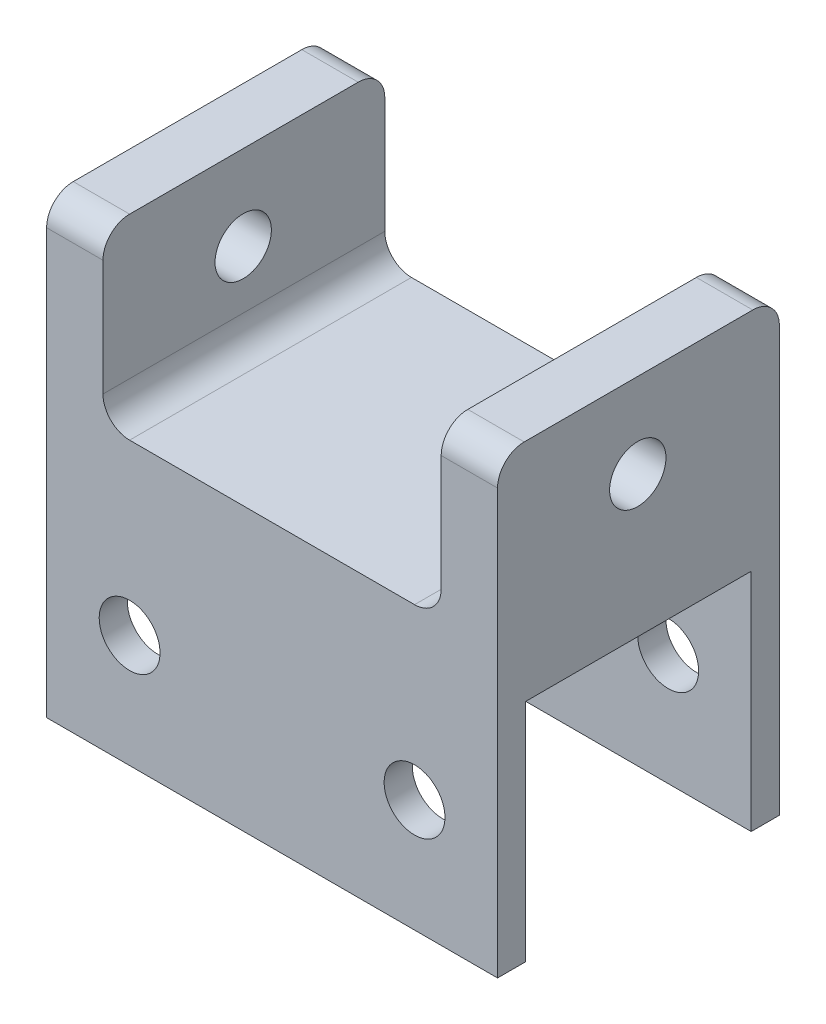
ISO-10303-21;
HEADER;
FILE_DESCRIPTION(('STEP AP214'),'2;1');
FILE_NAME('part.step','',(''),(''),'','','');
FILE_SCHEMA(('AUTOMOTIVE_DESIGN { 1 0 10303 214 1 1 1 1 }'));
ENDSEC;
DATA;
#1=APPLICATION_CONTEXT('core data for automotive mechanical design processes');
#2=APPLICATION_PROTOCOL_DEFINITION('international standard','automotive_design',2000,#1);
#3=PRODUCT_CONTEXT('',#1,'mechanical');
#4=PRODUCT('Part','Part','',(#3));
#5=PRODUCT_RELATED_PRODUCT_CATEGORY('part','',(#4));
#6=PRODUCT_DEFINITION_FORMATION('','',#4);
#7=PRODUCT_DEFINITION_CONTEXT('part definition',#1,'design');
#8=PRODUCT_DEFINITION('design','',#6,#7);
#9=PRODUCT_DEFINITION_SHAPE('','',#8);
#10=(LENGTH_UNIT() NAMED_UNIT(*) SI_UNIT(.MILLI.,.METRE.));
#11=(NAMED_UNIT(*) PLANE_ANGLE_UNIT() SI_UNIT($,.RADIAN.));
#12=(NAMED_UNIT(*) SI_UNIT($,.STERADIAN.) SOLID_ANGLE_UNIT());
#13=UNCERTAINTY_MEASURE_WITH_UNIT(LENGTH_MEASURE(1.E-05),#10,'distance_accuracy_value','');
#14=(GEOMETRIC_REPRESENTATION_CONTEXT(3) GLOBAL_UNCERTAINTY_ASSIGNED_CONTEXT((#13)) GLOBAL_UNIT_ASSIGNED_CONTEXT((#10,
#11,#12)) REPRESENTATION_CONTEXT('',''));
#15=CARTESIAN_POINT('',(0.,0.,0.));
#16=DIRECTION('',(0.,0.,1.));
#17=DIRECTION('',(1.,0.,0.));
#18=AXIS2_PLACEMENT_3D('',#15,#16,#17);
#19=CARTESIAN_POINT('',(0.,31.75,0.));
#20=DIRECTION('',(0.,1.,0.));
#21=DIRECTION('',(0.,0.,1.));
#22=AXIS2_PLACEMENT_3D('',#19,#20,#21);
#23=PLANE('',#22);
#24=DIRECTION('',(1.,0.,0.));
#25=VECTOR('',#24,1.);
#26=CARTESIAN_POINT('',(-109.740486484156,31.75,-28.2561073345159));
#27=LINE('',#26,#25);
#28=CARTESIAN_POINT('',(-100.390486484156,31.75,-28.2561073345159));
#29=VERTEX_POINT('',#28);
#30=CARTESIAN_POINT('',(-68.2904864841565,31.75,-28.2561073345159));
#31=VERTEX_POINT('',#30);
#32=EDGE_CURVE('E205',#29,#31,#27,.T.);
#33=ORIENTED_EDGE('',*,*,#32,.T.);
#34=DIRECTION('',(0.,0.,1.));
#35=VECTOR('',#34,1.);
#36=CARTESIAN_POINT('',(-68.2904864841565,31.75,0.));
#37=LINE('',#36,#35);
#38=CARTESIAN_POINT('',(-68.2904864841565,31.75,-60.0061073345159));
#39=VERTEX_POINT('',#38);
#40=EDGE_CURVE('E259',#31,#39,#37,.F.);
#41=ORIENTED_EDGE('',*,*,#40,.T.);
#42=DIRECTION('',(-1.,0.,0.));
#43=VECTOR('',#42,1.);
#44=CARTESIAN_POINT('',(-109.740486484156,31.75,-60.0061073345159));
#45=LINE('',#44,#43);
#46=CARTESIAN_POINT('',(-100.390486484156,31.75,-60.0061073345159));
#47=VERTEX_POINT('',#46);
#48=EDGE_CURVE('E201',#39,#47,#45,.T.);
#49=ORIENTED_EDGE('',*,*,#48,.T.);
#50=DIRECTION('',(0.,0.,-1.));
#51=VECTOR('',#50,1.);
#52=CARTESIAN_POINT('',(-100.390486484157,31.75,0.));
#53=LINE('',#52,#51);
#54=EDGE_CURVE('E257',#47,#29,#53,.F.);
#55=ORIENTED_EDGE('',*,*,#54,.T.);
#56=EDGE_LOOP('',(#33,#41,#49,#55));
#57=FACE_BOUND('',#56,.T.);
#58=ADVANCED_FACE('F33',(#57),#23,.T.);
#59=CARTESIAN_POINT('',(0.,0.,0.));
#60=DIRECTION('',(0.,1.,0.));
#61=DIRECTION('',(0.,0.,1.));
#62=AXIS2_PLACEMENT_3D('',#59,#60,#61);
#63=PLANE('',#62);
#64=DIRECTION('',(0.,0.,1.));
#65=VECTOR('',#64,1.);
#66=CARTESIAN_POINT('',(-109.740486484156,0.,-60.0061073345159));
#67=LINE('',#66,#65);
#68=CARTESIAN_POINT('',(-109.740486484156,0.,-31.4311073345159));
#69=VERTEX_POINT('',#68);
#70=CARTESIAN_POINT('',(-109.740486484156,0.,-28.2561073345159));
#71=VERTEX_POINT('',#70);
#72=EDGE_CURVE('E181',#69,#71,#67,.T.);
#73=ORIENTED_EDGE('',*,*,#72,.F.);
#74=DIRECTION('',(1.,0.,0.));
#75=VECTOR('',#74,1.);
#76=CARTESIAN_POINT('',(-109.740486484156,0.,-31.4311073345159));
#77=LINE('',#76,#75);
#78=CARTESIAN_POINT('',(-58.9404864841565,0.,-31.4311073345159));
#79=VERTEX_POINT('',#78);
#80=EDGE_CURVE('E162',#69,#79,#77,.T.);
#81=ORIENTED_EDGE('',*,*,#80,.T.);
#82=DIRECTION('',(0.,0.,-1.));
#83=VECTOR('',#82,1.);
#84=CARTESIAN_POINT('',(-58.9404864841565,0.,-60.0061073345159));
#85=LINE('',#84,#83);
#86=CARTESIAN_POINT('',(-58.9404864841565,0.,-28.2561073345159));
#87=VERTEX_POINT('',#86);
#88=EDGE_CURVE('E196',#87,#79,#85,.T.);
#89=ORIENTED_EDGE('',*,*,#88,.F.);
#90=DIRECTION('',(1.,0.,0.));
#91=VECTOR('',#90,1.);
#92=CARTESIAN_POINT('',(-109.740486484156,0.,-28.2561073345159));
#93=LINE('',#92,#91);
#94=EDGE_CURVE('E190',#71,#87,#93,.T.);
#95=ORIENTED_EDGE('',*,*,#94,.F.);
#96=EDGE_LOOP('',(#73,#81,#89,#95));
#97=FACE_BOUND('',#96,.T.);
#98=ADVANCED_FACE('F188',(#97),#63,.F.);
#99=CARTESIAN_POINT('',(-58.9404864841565,31.75,-60.0061073345159));
#100=DIRECTION('',(-1.,0.,0.));
#101=DIRECTION('',(0.,0.,1.));
#102=AXIS2_PLACEMENT_3D('',#99,#100,#101);
#103=PLANE('',#102);
#104=CARTESIAN_POINT('',(-58.9404864841564,41.275,-44.0530571686081));
#105=DIRECTION('',(1.,0.,0.));
#106=DIRECTION('',(0.,0.,-1.));
#107=AXIS2_PLACEMENT_3D('',#104,#105,#106);
#108=CIRCLE('',#107,3.175);
#109=CARTESIAN_POINT('',(-58.9404864841564,41.275,-47.2280571686081));
#110=VERTEX_POINT('',#109);
#111=EDGE_CURVE('E272',#110,#110,#108,.T.);
#112=ORIENTED_EDGE('',*,*,#111,.F.);
#113=EDGE_LOOP('',(#112));
#114=FACE_BOUND('',#113,.T.);
#115=DIRECTION('',(0.,0.,-1.));
#116=VECTOR('',#115,1.);
#117=CARTESIAN_POINT('',(-58.9404864841565,50.8,-60.0061073345159));
#118=LINE('',#117,#116);
#119=CARTESIAN_POINT('',(-58.9404864841565,50.8,-31.2561073345159));
#120=VERTEX_POINT('',#119);
#121=CARTESIAN_POINT('',(-58.9404864841565,50.8,-57.0061073345159));
#122=VERTEX_POINT('',#121);
#123=EDGE_CURVE('E294',#120,#122,#118,.T.);
#124=ORIENTED_EDGE('',*,*,#123,.F.);
#125=CARTESIAN_POINT('',(-58.9404864841565,47.8,-31.2561073345159));
#126=DIRECTION('',(-1.,0.,0.));
#127=DIRECTION('',(0.,0.,1.));
#128=AXIS2_PLACEMENT_3D('',#125,#126,#127);
#129=CIRCLE('',#128,3.);
#130=CARTESIAN_POINT('',(-58.9404864841565,47.8,-28.2561073345159));
#131=VERTEX_POINT('',#130);
#132=EDGE_CURVE('E250',#120,#131,#129,.F.);
#133=ORIENTED_EDGE('',*,*,#132,.T.);
#134=DIRECTION('',(0.,-1.,0.));
#135=VECTOR('',#134,1.);
#136=CARTESIAN_POINT('',(-58.9404864841565,31.75,-28.2561073345159));
#137=LINE('',#136,#135);
#138=EDGE_CURVE('E202',#131,#87,#137,.T.);
#139=ORIENTED_EDGE('',*,*,#138,.T.);
#140=ORIENTED_EDGE('',*,*,#88,.T.);
#141=DIRECTION('',(0.,-1.,0.));
#142=VECTOR('',#141,1.);
#143=CARTESIAN_POINT('',(-58.9404864841565,25.4,-31.4311073345159));
#144=LINE('',#143,#142);
#145=CARTESIAN_POINT('',(-58.9404864841565,25.4,-31.4311073345159));
#146=VERTEX_POINT('',#145);
#147=EDGE_CURVE('E168',#146,#79,#144,.T.);
#148=ORIENTED_EDGE('',*,*,#147,.F.);
#149=DIRECTION('',(0.,0.,1.));
#150=VECTOR('',#149,1.);
#151=CARTESIAN_POINT('',(-58.9404864841565,25.4,-31.4311073345159));
#152=LINE('',#151,#150);
#153=CARTESIAN_POINT('',(-58.9404864841565,25.4,-56.8311073345159));
#154=VERTEX_POINT('',#153);
#155=EDGE_CURVE('E186',#154,#146,#152,.T.);
#156=ORIENTED_EDGE('',*,*,#155,.F.);
#157=DIRECTION('',(0.,1.,0.));
#158=VECTOR('',#157,1.);
#159=CARTESIAN_POINT('',(-58.9404864841565,25.4,-56.8311073345159));
#160=LINE('',#159,#158);
#161=CARTESIAN_POINT('',(-58.9404864841565,0.,-56.8311073345159));
#162=VERTEX_POINT('',#161);
#163=EDGE_CURVE('E314',#162,#154,#160,.T.);
#164=ORIENTED_EDGE('',*,*,#163,.F.);
#165=CARTESIAN_POINT('',(-58.9404864841565,0.,-60.0061073345159));
#166=VERTEX_POINT('',#165);
#167=EDGE_CURVE('E321',#162,#166,#85,.T.);
#168=ORIENTED_EDGE('',*,*,#167,.T.);
#169=DIRECTION('',(0.,-1.,0.));
#170=VECTOR('',#169,1.);
#171=CARTESIAN_POINT('',(-58.9404864841565,31.75,-60.0061073345159));
#172=LINE('',#171,#170);
#173=CARTESIAN_POINT('',(-58.9404864841565,47.8,-60.0061073345159));
#174=VERTEX_POINT('',#173);
#175=EDGE_CURVE('E209',#174,#166,#172,.T.);
#176=ORIENTED_EDGE('',*,*,#175,.F.);
#177=CARTESIAN_POINT('',(-58.9404864841565,47.8,-57.0061073345159));
#178=DIRECTION('',(-1.,0.,0.));
#179=DIRECTION('',(0.,0.,1.));
#180=AXIS2_PLACEMENT_3D('',#177,#178,#179);
#181=CIRCLE('',#180,3.);
#182=EDGE_CURVE('E248',#174,#122,#181,.F.);
#183=ORIENTED_EDGE('',*,*,#182,.T.);
#184=EDGE_LOOP('',(#124,#133,#139,#140,#148,#156,#164,#168,#176,#183));
#185=FACE_BOUND('',#184,.T.);
#186=ADVANCED_FACE('F334',(#114,#185),#103,.F.);
#187=CARTESIAN_POINT('',(-109.740486484156,31.75,-60.0061073345159));
#188=DIRECTION('',(0.,0.,1.));
#189=DIRECTION('',(1.,0.,0.));
#190=AXIS2_PLACEMENT_3D('',#187,#188,#189);
#191=PLANE('',#190);
#192=CARTESIAN_POINT('',(-100.390486484156,12.7,-60.0061073345159));
#193=DIRECTION('',(0.,0.,-1.));
#194=DIRECTION('',(-1.,0.,0.));
#195=AXIS2_PLACEMENT_3D('',#192,#193,#194);
#196=CIRCLE('',#195,3.429);
#197=CARTESIAN_POINT('',(-103.819486484156,12.7,-60.0061073345159));
#198=VERTEX_POINT('',#197);
#199=EDGE_CURVE('E469',#198,#198,#196,.T.);
#200=ORIENTED_EDGE('',*,*,#199,.F.);
#201=EDGE_LOOP('',(#200));
#202=FACE_BOUND('',#201,.T.);
#203=CARTESIAN_POINT('',(-68.2904864841565,12.7,-60.0061073345159));
#204=DIRECTION('',(0.,0.,-1.));
#205=DIRECTION('',(-1.,0.,0.));
#206=AXIS2_PLACEMENT_3D('',#203,#204,#205);
#207=CIRCLE('',#206,3.429);
#208=CARTESIAN_POINT('',(-71.7194864841565,12.7,-60.0061073345159));
#209=VERTEX_POINT('',#208);
#210=EDGE_CURVE('E275',#209,#209,#207,.T.);
#211=ORIENTED_EDGE('',*,*,#210,.F.);
#212=EDGE_LOOP('',(#211));
#213=FACE_BOUND('',#212,.T.);
#214=DIRECTION('',(0.,-1.,0.));
#215=VECTOR('',#214,1.);
#216=CARTESIAN_POINT('',(-109.740486484156,31.75,-60.0061073345159));
#217=LINE('',#216,#215);
#218=CARTESIAN_POINT('',(-109.740486484156,47.8,-60.0061073345159));
#219=VERTEX_POINT('',#218);
#220=CARTESIAN_POINT('',(-109.740486484156,0.,-60.0061073345159));
#221=VERTEX_POINT('',#220);
#222=EDGE_CURVE('E207',#219,#221,#217,.T.);
#223=ORIENTED_EDGE('',*,*,#222,.F.);
#224=DIRECTION('',(-1.,0.,0.));
#225=VECTOR('',#224,1.);
#226=CARTESIAN_POINT('',(-109.740486484156,47.8,-60.0061073345159));
#227=LINE('',#226,#225);
#228=CARTESIAN_POINT('',(-103.390486484156,47.8,-60.0061073345159));
#229=VERTEX_POINT('',#228);
#230=EDGE_CURVE('E439',#219,#229,#227,.F.);
#231=ORIENTED_EDGE('',*,*,#230,.T.);
#232=DIRECTION('',(0.,-1.,0.));
#233=VECTOR('',#232,1.);
#234=CARTESIAN_POINT('',(-103.390486484156,50.8,-60.0061073345159));
#235=LINE('',#234,#233);
#236=CARTESIAN_POINT('',(-103.390486484156,34.75,-60.0061073345159));
#237=VERTEX_POINT('',#236);
#238=EDGE_CURVE('E217',#229,#237,#235,.T.);
#239=ORIENTED_EDGE('',*,*,#238,.T.);
#240=CARTESIAN_POINT('',(-100.390486484156,34.75,-60.0061073345159));
#241=DIRECTION('',(0.,0.,1.));
#242=DIRECTION('',(1.,0.,0.));
#243=AXIS2_PLACEMENT_3D('',#240,#241,#242);
#244=CIRCLE('',#243,3.);
#245=EDGE_CURVE('E42',#237,#47,#244,.T.);
#246=ORIENTED_EDGE('',*,*,#245,.T.);
#247=ORIENTED_EDGE('',*,*,#48,.F.);
#248=CARTESIAN_POINT('',(-68.2904864841565,34.75,-60.0061073345159));
#249=DIRECTION('',(0.,0.,1.));
#250=DIRECTION('',(1.,0.,0.));
#251=AXIS2_PLACEMENT_3D('',#248,#249,#250);
#252=CIRCLE('',#251,3.);
#253=CARTESIAN_POINT('',(-65.2904864841565,34.75,-60.0061073345159));
#254=VERTEX_POINT('',#253);
#255=EDGE_CURVE('E263',#39,#254,#252,.T.);
#256=ORIENTED_EDGE('',*,*,#255,.T.);
#257=DIRECTION('',(0.,-1.,0.));
#258=VECTOR('',#257,1.);
#259=CARTESIAN_POINT('',(-65.2904864841565,50.8,-60.0061073345159));
#260=LINE('',#259,#258);
#261=CARTESIAN_POINT('',(-65.2904864841565,47.8,-60.0061073345159));
#262=VERTEX_POINT('',#261);
#263=EDGE_CURVE('E302',#262,#254,#260,.T.);
#264=ORIENTED_EDGE('',*,*,#263,.F.);
#265=DIRECTION('',(-1.,0.,0.));
#266=VECTOR('',#265,1.);
#267=CARTESIAN_POINT('',(-109.740486484156,47.8,-60.0061073345159));
#268=LINE('',#267,#266);
#269=EDGE_CURVE('E227',#262,#174,#268,.F.);
#270=ORIENTED_EDGE('',*,*,#269,.T.);
#271=ORIENTED_EDGE('',*,*,#175,.T.);
#272=DIRECTION('',(-1.,0.,0.));
#273=VECTOR('',#272,1.);
#274=CARTESIAN_POINT('',(-109.740486484156,0.,-60.0061073345159));
#275=LINE('',#274,#273);
#276=EDGE_CURVE('E192',#166,#221,#275,.T.);
#277=ORIENTED_EDGE('',*,*,#276,.T.);
#278=EDGE_LOOP('',(#223,#231,#239,#246,#247,#256,#264,#270,#271,#277));
#279=FACE_BOUND('',#278,.T.);
#280=ADVANCED_FACE('F390',(#202,#213,#279),#191,.F.);
#281=CARTESIAN_POINT('',(-109.740486484156,31.75,-60.0061073345159));
#282=DIRECTION('',(1.,0.,0.));
#283=DIRECTION('',(0.,0.,-1.));
#284=AXIS2_PLACEMENT_3D('',#281,#282,#283);
#285=PLANE('',#284);
#286=CARTESIAN_POINT('',(-109.740486484156,41.275,-44.0530571686081));
#287=DIRECTION('',(1.,0.,0.));
#288=DIRECTION('',(0.,0.,-1.));
#289=AXIS2_PLACEMENT_3D('',#286,#287,#288);
#290=CIRCLE('',#289,3.175);
#291=CARTESIAN_POINT('',(-109.740486484156,41.275,-47.2280571686081));
#292=VERTEX_POINT('',#291);
#293=EDGE_CURVE('E287',#292,#292,#290,.T.);
#294=ORIENTED_EDGE('',*,*,#293,.T.);
#295=EDGE_LOOP('',(#294));
#296=FACE_BOUND('',#295,.T.);
#297=DIRECTION('',(0.,0.,1.));
#298=VECTOR('',#297,1.);
#299=CARTESIAN_POINT('',(-109.740486484156,50.8,-60.0061073345159));
#300=LINE('',#299,#298);
#301=CARTESIAN_POINT('',(-109.740486484156,50.8,-57.0061073345159));
#302=VERTEX_POINT('',#301);
#303=CARTESIAN_POINT('',(-109.740486484156,50.8,-31.2561073345159));
#304=VERTEX_POINT('',#303);
#305=EDGE_CURVE('E308',#302,#304,#300,.T.);
#306=ORIENTED_EDGE('',*,*,#305,.F.);
#307=CARTESIAN_POINT('',(-109.740486484156,47.8,-57.0061073345159));
#308=DIRECTION('',(1.,0.,0.));
#309=DIRECTION('',(0.,0.,-1.));
#310=AXIS2_PLACEMENT_3D('',#307,#308,#309);
#311=CIRCLE('',#310,3.);
#312=EDGE_CURVE('E222',#302,#219,#311,.F.);
#313=ORIENTED_EDGE('',*,*,#312,.T.);
#314=ORIENTED_EDGE('',*,*,#222,.T.);
#315=CARTESIAN_POINT('',(-109.740486484156,0.,-56.8311073345159));
#316=VERTEX_POINT('',#315);
#317=EDGE_CURVE('E191',#221,#316,#67,.T.);
#318=ORIENTED_EDGE('',*,*,#317,.T.);
#319=DIRECTION('',(0.,1.,0.));
#320=VECTOR('',#319,1.);
#321=CARTESIAN_POINT('',(-109.740486484156,25.4,-56.8311073345159));
#322=LINE('',#321,#320);
#323=CARTESIAN_POINT('',(-109.740486484156,25.4,-56.8311073345159));
#324=VERTEX_POINT('',#323);
#325=EDGE_CURVE('E185',#316,#324,#322,.T.);
#326=ORIENTED_EDGE('',*,*,#325,.T.);
#327=DIRECTION('',(0.,0.,1.));
#328=VECTOR('',#327,1.);
#329=CARTESIAN_POINT('',(-109.740486484156,25.4,-31.4311073345159));
#330=LINE('',#329,#328);
#331=CARTESIAN_POINT('',(-109.740486484156,25.4,-31.4311073345159));
#332=VERTEX_POINT('',#331);
#333=EDGE_CURVE('E174',#324,#332,#330,.T.);
#334=ORIENTED_EDGE('',*,*,#333,.T.);
#335=DIRECTION('',(0.,-1.,0.));
#336=VECTOR('',#335,1.);
#337=CARTESIAN_POINT('',(-109.740486484156,25.4,-31.4311073345159));
#338=LINE('',#337,#336);
#339=EDGE_CURVE('E165',#332,#69,#338,.T.);
#340=ORIENTED_EDGE('',*,*,#339,.T.);
#341=ORIENTED_EDGE('',*,*,#72,.T.);
#342=DIRECTION('',(0.,-1.,0.));
#343=VECTOR('',#342,1.);
#344=CARTESIAN_POINT('',(-109.740486484156,31.75,-28.2561073345159));
#345=LINE('',#344,#343);
#346=CARTESIAN_POINT('',(-109.740486484156,47.8,-28.2561073345159));
#347=VERTEX_POINT('',#346);
#348=EDGE_CURVE('E204',#347,#71,#345,.T.);
#349=ORIENTED_EDGE('',*,*,#348,.F.);
#350=CARTESIAN_POINT('',(-109.740486484156,47.8,-31.2561073345159));
#351=DIRECTION('',(1.,0.,0.));
#352=DIRECTION('',(0.,0.,-1.));
#353=AXIS2_PLACEMENT_3D('',#350,#351,#352);
#354=CIRCLE('',#353,3.);
#355=EDGE_CURVE('E345',#347,#304,#354,.F.);
#356=ORIENTED_EDGE('',*,*,#355,.T.);
#357=EDGE_LOOP('',(#306,#313,#314,#318,#326,#334,#340,#341,#349,#356));
#358=FACE_BOUND('',#357,.T.);
#359=ADVANCED_FACE('F179',(#296,#358),#285,.F.);
#360=CARTESIAN_POINT('',(-109.740486484156,31.75,-28.2561073345159));
#361=DIRECTION('',(0.,0.,-1.));
#362=DIRECTION('',(-1.,0.,0.));
#363=AXIS2_PLACEMENT_3D('',#360,#361,#362);
#364=PLANE('',#363);
#365=CARTESIAN_POINT('',(-100.390486484156,12.7,-28.2561073345159));
#366=DIRECTION('',(0.,0.,-1.));
#367=DIRECTION('',(-1.,0.,0.));
#368=AXIS2_PLACEMENT_3D('',#365,#366,#367);
#369=CIRCLE('',#368,3.429);
#370=CARTESIAN_POINT('',(-103.819486484156,12.7,-28.2561073345159));
#371=VERTEX_POINT('',#370);
#372=EDGE_CURVE('E466',#371,#371,#369,.T.);
#373=ORIENTED_EDGE('',*,*,#372,.T.);
#374=EDGE_LOOP('',(#373));
#375=FACE_BOUND('',#374,.T.);
#376=CARTESIAN_POINT('',(-68.2904864841565,12.7,-28.2561073345159));
#377=DIRECTION('',(0.,0.,-1.));
#378=DIRECTION('',(-1.,0.,0.));
#379=AXIS2_PLACEMENT_3D('',#376,#377,#378);
#380=CIRCLE('',#379,3.429);
#381=CARTESIAN_POINT('',(-71.7194864841565,12.7,-28.2561073345159));
#382=VERTEX_POINT('',#381);
#383=EDGE_CURVE('E268',#382,#382,#380,.T.);
#384=ORIENTED_EDGE('',*,*,#383,.T.);
#385=EDGE_LOOP('',(#384));
#386=FACE_BOUND('',#385,.T.);
#387=DIRECTION('',(0.,-1.,0.));
#388=VECTOR('',#387,1.);
#389=CARTESIAN_POINT('',(-103.390486484156,50.8,-28.2561073345159));
#390=LINE('',#389,#388);
#391=CARTESIAN_POINT('',(-103.390486484156,47.8,-28.2561073345159));
#392=VERTEX_POINT('',#391);
#393=CARTESIAN_POINT('',(-103.390486484156,34.75,-28.2561073345159));
#394=VERTEX_POINT('',#393);
#395=EDGE_CURVE('E221',#392,#394,#390,.T.);
#396=ORIENTED_EDGE('',*,*,#395,.F.);
#397=DIRECTION('',(1.,0.,0.));
#398=VECTOR('',#397,1.);
#399=CARTESIAN_POINT('',(-109.740486484156,47.8,-28.2561073345159));
#400=LINE('',#399,#398);
#401=EDGE_CURVE('E241',#392,#347,#400,.F.);
#402=ORIENTED_EDGE('',*,*,#401,.T.);
#403=ORIENTED_EDGE('',*,*,#348,.T.);
#404=ORIENTED_EDGE('',*,*,#94,.T.);
#405=ORIENTED_EDGE('',*,*,#138,.F.);
#406=DIRECTION('',(1.,0.,0.));
#407=VECTOR('',#406,1.);
#408=CARTESIAN_POINT('',(-109.740486484156,47.8,-28.2561073345159));
#409=LINE('',#408,#407);
#410=CARTESIAN_POINT('',(-65.2904864841565,47.8,-28.2561073345159));
#411=VERTEX_POINT('',#410);
#412=EDGE_CURVE('E239',#131,#411,#409,.F.);
#413=ORIENTED_EDGE('',*,*,#412,.T.);
#414=DIRECTION('',(0.,-1.,0.));
#415=VECTOR('',#414,1.);
#416=CARTESIAN_POINT('',(-65.2904864841565,50.8,-28.2561073345159));
#417=LINE('',#416,#415);
#418=CARTESIAN_POINT('',(-65.2904864841565,34.75,-28.2561073345159));
#419=VERTEX_POINT('',#418);
#420=EDGE_CURVE('E299',#411,#419,#417,.T.);
#421=ORIENTED_EDGE('',*,*,#420,.T.);
#422=CARTESIAN_POINT('',(-68.2904864841565,34.75,-28.2561073345159));
#423=DIRECTION('',(0.,0.,-1.));
#424=DIRECTION('',(-1.,0.,0.));
#425=AXIS2_PLACEMENT_3D('',#422,#423,#424);
#426=CIRCLE('',#425,3.);
#427=EDGE_CURVE('E261',#419,#31,#426,.T.);
#428=ORIENTED_EDGE('',*,*,#427,.T.);
#429=ORIENTED_EDGE('',*,*,#32,.F.);
#430=CARTESIAN_POINT('',(-100.390486484156,34.75,-28.2561073345159));
#431=DIRECTION('',(0.,0.,-1.));
#432=DIRECTION('',(-1.,0.,0.));
#433=AXIS2_PLACEMENT_3D('',#430,#431,#432);
#434=CIRCLE('',#433,3.);
#435=EDGE_CURVE('E11',#29,#394,#434,.T.);
#436=ORIENTED_EDGE('',*,*,#435,.T.);
#437=EDGE_LOOP('',(#396,#402,#403,#404,#405,#413,#421,#428,#429,#436));
#438=FACE_BOUND('',#437,.T.);
#439=ADVANCED_FACE('F342',(#375,#386,#438),#364,.F.);
#440=ORIENTED_EDGE('',*,*,#167,.F.);
#441=DIRECTION('',(1.,0.,0.));
#442=VECTOR('',#441,1.);
#443=CARTESIAN_POINT('',(-109.740486484156,0.,-56.8311073345159));
#444=LINE('',#443,#442);
#445=EDGE_CURVE('E173',#316,#162,#444,.T.);
#446=ORIENTED_EDGE('',*,*,#445,.F.);
#447=ORIENTED_EDGE('',*,*,#317,.F.);
#448=ORIENTED_EDGE('',*,*,#276,.F.);
#449=EDGE_LOOP('',(#440,#446,#447,#448));
#450=FACE_BOUND('',#449,.T.);
#451=ADVANCED_FACE('F337',(#450),#63,.F.);
#452=CARTESIAN_POINT('',(-109.740486484156,25.4,-31.4311073345159));
#453=DIRECTION('',(0.,0.,1.));
#454=DIRECTION('',(1.,0.,0.));
#455=AXIS2_PLACEMENT_3D('',#452,#453,#454);
#456=PLANE('',#455);
#457=CARTESIAN_POINT('',(-100.390486484156,12.7,-31.4311073345159));
#458=DIRECTION('',(0.,0.,1.));
#459=DIRECTION('',(1.,0.,0.));
#460=AXIS2_PLACEMENT_3D('',#457,#458,#459);
#461=CIRCLE('',#460,3.429);
#462=CARTESIAN_POINT('',(-96.9614864841565,12.7,-31.4311073345159));
#463=VERTEX_POINT('',#462);
#464=EDGE_CURVE('E280',#463,#463,#461,.T.);
#465=ORIENTED_EDGE('',*,*,#464,.T.);
#466=EDGE_LOOP('',(#465));
#467=FACE_BOUND('',#466,.T.);
#468=CARTESIAN_POINT('',(-68.2904864841565,12.7,-31.4311073345159));
#469=DIRECTION('',(0.,0.,1.));
#470=DIRECTION('',(1.,0.,0.));
#471=AXIS2_PLACEMENT_3D('',#468,#469,#470);
#472=CIRCLE('',#471,3.429);
#473=CARTESIAN_POINT('',(-64.8614864841565,12.7,-31.4311073345159));
#474=VERTEX_POINT('',#473);
#475=EDGE_CURVE('E267',#474,#474,#472,.T.);
#476=ORIENTED_EDGE('',*,*,#475,.T.);
#477=EDGE_LOOP('',(#476));
#478=FACE_BOUND('',#477,.T.);
#479=ORIENTED_EDGE('',*,*,#147,.T.);
#480=ORIENTED_EDGE('',*,*,#80,.F.);
#481=ORIENTED_EDGE('',*,*,#339,.F.);
#482=DIRECTION('',(1.,0.,0.));
#483=VECTOR('',#482,1.);
#484=CARTESIAN_POINT('',(-109.740486484156,25.4,-31.4311073345159));
#485=LINE('',#484,#483);
#486=EDGE_CURVE('E319',#332,#146,#485,.T.);
#487=ORIENTED_EDGE('',*,*,#486,.T.);
#488=EDGE_LOOP('',(#479,#480,#481,#487));
#489=FACE_BOUND('',#488,.T.);
#490=ADVANCED_FACE('F164',(#467,#478,#489),#456,.F.);
#491=CARTESIAN_POINT('',(-109.740486484156,25.4,-31.4311073345159));
#492=DIRECTION('',(0.,1.,0.));
#493=DIRECTION('',(0.,0.,1.));
#494=AXIS2_PLACEMENT_3D('',#491,#492,#493);
#495=PLANE('',#494);
#496=ORIENTED_EDGE('',*,*,#155,.T.);
#497=ORIENTED_EDGE('',*,*,#486,.F.);
#498=ORIENTED_EDGE('',*,*,#333,.F.);
#499=DIRECTION('',(1.,0.,0.));
#500=VECTOR('',#499,1.);
#501=CARTESIAN_POINT('',(-109.740486484156,25.4,-56.8311073345159));
#502=LINE('',#501,#500);
#503=EDGE_CURVE('E322',#324,#154,#502,.T.);
#504=ORIENTED_EDGE('',*,*,#503,.T.);
#505=EDGE_LOOP('',(#496,#497,#498,#504));
#506=FACE_BOUND('',#505,.T.);
#507=ADVANCED_FACE('F456',(#506),#495,.F.);
#508=CARTESIAN_POINT('',(-109.740486484156,25.4,-56.8311073345159));
#509=DIRECTION('',(0.,0.,-1.));
#510=DIRECTION('',(-1.,0.,0.));
#511=AXIS2_PLACEMENT_3D('',#508,#509,#510);
#512=PLANE('',#511);
#513=CARTESIAN_POINT('',(-100.390486484156,12.7,-56.8311073345159));
#514=DIRECTION('',(0.,0.,-1.));
#515=DIRECTION('',(-1.,0.,0.));
#516=AXIS2_PLACEMENT_3D('',#513,#514,#515);
#517=CIRCLE('',#516,3.429);
#518=CARTESIAN_POINT('',(-103.819486484156,12.7,-56.8311073345159));
#519=VERTEX_POINT('',#518);
#520=EDGE_CURVE('E37',#519,#519,#517,.T.);
#521=ORIENTED_EDGE('',*,*,#520,.T.);
#522=EDGE_LOOP('',(#521));
#523=FACE_BOUND('',#522,.T.);
#524=CARTESIAN_POINT('',(-68.2904864841565,12.7,-56.8311073345159));
#525=DIRECTION('',(0.,0.,-1.));
#526=DIRECTION('',(-1.,0.,0.));
#527=AXIS2_PLACEMENT_3D('',#524,#525,#526);
#528=CIRCLE('',#527,3.429);
#529=CARTESIAN_POINT('',(-71.7194864841565,12.7,-56.8311073345159));
#530=VERTEX_POINT('',#529);
#531=EDGE_CURVE('E265',#530,#530,#528,.T.);
#532=ORIENTED_EDGE('',*,*,#531,.T.);
#533=EDGE_LOOP('',(#532));
#534=FACE_BOUND('',#533,.T.);
#535=ORIENTED_EDGE('',*,*,#163,.T.);
#536=ORIENTED_EDGE('',*,*,#503,.F.);
#537=ORIENTED_EDGE('',*,*,#325,.F.);
#538=ORIENTED_EDGE('',*,*,#445,.T.);
#539=EDGE_LOOP('',(#535,#536,#537,#538));
#540=FACE_BOUND('',#539,.T.);
#541=ADVANCED_FACE('F326',(#523,#534,#540),#512,.F.);
#542=CARTESIAN_POINT('',(-103.390486484156,50.8,-60.0061073345159));
#543=DIRECTION('',(-1.,0.,0.));
#544=DIRECTION('',(0.,0.,1.));
#545=AXIS2_PLACEMENT_3D('',#542,#543,#544);
#546=PLANE('',#545);
#547=CARTESIAN_POINT('',(-103.390486484156,41.275,-44.0530571686081));
#548=DIRECTION('',(-1.,0.,0.));
#549=DIRECTION('',(0.,0.,1.));
#550=AXIS2_PLACEMENT_3D('',#547,#548,#549);
#551=CIRCLE('',#550,3.175);
#552=CARTESIAN_POINT('',(-103.390486484156,41.275,-40.8780571686082));
#553=VERTEX_POINT('',#552);
#554=EDGE_CURVE('E291',#553,#553,#551,.T.);
#555=ORIENTED_EDGE('',*,*,#554,.T.);
#556=EDGE_LOOP('',(#555));
#557=FACE_BOUND('',#556,.T.);
#558=ORIENTED_EDGE('',*,*,#238,.F.);
#559=CARTESIAN_POINT('',(-103.390486484156,47.8,-57.0061073345159));
#560=DIRECTION('',(-1.,0.,0.));
#561=DIRECTION('',(0.,0.,1.));
#562=AXIS2_PLACEMENT_3D('',#559,#560,#561);
#563=CIRCLE('',#562,3.);
#564=CARTESIAN_POINT('',(-103.390486484156,50.8,-57.0061073345159));
#565=VERTEX_POINT('',#564);
#566=EDGE_CURVE('E237',#229,#565,#563,.F.);
#567=ORIENTED_EDGE('',*,*,#566,.T.);
#568=DIRECTION('',(0.,0.,-1.));
#569=VECTOR('',#568,1.);
#570=CARTESIAN_POINT('',(-103.390486484156,50.8,-60.0061073345159));
#571=LINE('',#570,#569);
#572=CARTESIAN_POINT('',(-103.390486484156,50.8,-31.2561073345159));
#573=VERTEX_POINT('',#572);
#574=EDGE_CURVE('E305',#573,#565,#571,.T.);
#575=ORIENTED_EDGE('',*,*,#574,.F.);
#576=CARTESIAN_POINT('',(-103.390486484156,47.8,-31.2561073345159));
#577=DIRECTION('',(-1.,0.,0.));
#578=DIRECTION('',(0.,0.,1.));
#579=AXIS2_PLACEMENT_3D('',#576,#577,#578);
#580=CIRCLE('',#579,3.);
#581=EDGE_CURVE('E436',#573,#392,#580,.F.);
#582=ORIENTED_EDGE('',*,*,#581,.T.);
#583=ORIENTED_EDGE('',*,*,#395,.T.);
#584=DIRECTION('',(0.,0.,-1.));
#585=VECTOR('',#584,1.);
#586=CARTESIAN_POINT('',(-103.390486484156,34.75,-60.0061073345159));
#587=LINE('',#586,#585);
#588=EDGE_CURVE('E430',#394,#237,#587,.T.);
#589=ORIENTED_EDGE('',*,*,#588,.T.);
#590=EDGE_LOOP('',(#558,#567,#575,#582,#583,#589));
#591=FACE_BOUND('',#590,.T.);
#592=ADVANCED_FACE('F434',(#557,#591),#546,.F.);
#593=CARTESIAN_POINT('',(0.,50.8,0.));
#594=DIRECTION('',(0.,-1.,0.));
#595=DIRECTION('',(0.,0.,-1.));
#596=AXIS2_PLACEMENT_3D('',#593,#594,#595);
#597=PLANE('',#596);
#598=ORIENTED_EDGE('',*,*,#574,.T.);
#599=DIRECTION('',(-1.,0.,0.));
#600=VECTOR('',#599,1.);
#601=CARTESIAN_POINT('',(0.,50.8,-57.0061073345159));
#602=LINE('',#601,#600);
#603=EDGE_CURVE('E350',#565,#302,#602,.T.);
#604=ORIENTED_EDGE('',*,*,#603,.T.);
#605=ORIENTED_EDGE('',*,*,#305,.T.);
#606=DIRECTION('',(1.,0.,0.));
#607=VECTOR('',#606,1.);
#608=CARTESIAN_POINT('',(0.,50.8,-31.2561073345159));
#609=LINE('',#608,#607);
#610=EDGE_CURVE('E211',#304,#573,#609,.T.);
#611=ORIENTED_EDGE('',*,*,#610,.T.);
#612=EDGE_LOOP('',(#598,#604,#605,#611));
#613=FACE_BOUND('',#612,.T.);
#614=ADVANCED_FACE('F444',(#613),#597,.F.);
#615=CARTESIAN_POINT('',(-65.2904864841565,50.8,-60.0061073345159));
#616=DIRECTION('',(1.,0.,0.));
#617=DIRECTION('',(0.,0.,-1.));
#618=AXIS2_PLACEMENT_3D('',#615,#616,#617);
#619=PLANE('',#618);
#620=CARTESIAN_POINT('',(-65.2904864841565,41.275,-44.0530571686081));
#621=DIRECTION('',(1.,0.,0.));
#622=DIRECTION('',(0.,0.,-1.));
#623=AXIS2_PLACEMENT_3D('',#620,#621,#622);
#624=CIRCLE('',#623,3.175);
#625=CARTESIAN_POINT('',(-65.2904864841565,41.275,-47.2280571686081));
#626=VERTEX_POINT('',#625);
#627=EDGE_CURVE('E290',#626,#626,#624,.T.);
#628=ORIENTED_EDGE('',*,*,#627,.T.);
#629=EDGE_LOOP('',(#628));
#630=FACE_BOUND('',#629,.T.);
#631=ORIENTED_EDGE('',*,*,#420,.F.);
#632=CARTESIAN_POINT('',(-65.2904864841565,47.8,-31.2561073345159));
#633=DIRECTION('',(1.,0.,0.));
#634=DIRECTION('',(0.,0.,-1.));
#635=AXIS2_PLACEMENT_3D('',#632,#633,#634);
#636=CIRCLE('',#635,3.);
#637=CARTESIAN_POINT('',(-65.2904864841565,50.8,-31.2561073345159));
#638=VERTEX_POINT('',#637);
#639=EDGE_CURVE('E50',#411,#638,#636,.F.);
#640=ORIENTED_EDGE('',*,*,#639,.T.);
#641=DIRECTION('',(0.,0.,1.));
#642=VECTOR('',#641,1.);
#643=CARTESIAN_POINT('',(-65.2904864841565,50.8,-60.0061073345159));
#644=LINE('',#643,#642);
#645=CARTESIAN_POINT('',(-65.2904864841565,50.8,-57.0061073345159));
#646=VERTEX_POINT('',#645);
#647=EDGE_CURVE('E297',#646,#638,#644,.T.);
#648=ORIENTED_EDGE('',*,*,#647,.F.);
#649=CARTESIAN_POINT('',(-65.2904864841565,47.8,-57.0061073345159));
#650=DIRECTION('',(1.,0.,0.));
#651=DIRECTION('',(0.,0.,-1.));
#652=AXIS2_PLACEMENT_3D('',#649,#650,#651);
#653=CIRCLE('',#652,3.);
#654=EDGE_CURVE('E58',#646,#262,#653,.F.);
#655=ORIENTED_EDGE('',*,*,#654,.T.);
#656=ORIENTED_EDGE('',*,*,#263,.T.);
#657=DIRECTION('',(0.,0.,1.));
#658=VECTOR('',#657,1.);
#659=CARTESIAN_POINT('',(-65.2904864841565,34.75,-60.0061073345159));
#660=LINE('',#659,#658);
#661=EDGE_CURVE('E252',#254,#419,#660,.T.);
#662=ORIENTED_EDGE('',*,*,#661,.T.);
#663=EDGE_LOOP('',(#631,#640,#648,#655,#656,#662));
#664=FACE_BOUND('',#663,.T.);
#665=ADVANCED_FACE('F357',(#630,#664),#619,.F.);
#666=CARTESIAN_POINT('',(0.,50.8,0.));
#667=DIRECTION('',(0.,-1.,0.));
#668=DIRECTION('',(0.,0.,-1.));
#669=AXIS2_PLACEMENT_3D('',#666,#667,#668);
#670=PLANE('',#669);
#671=ORIENTED_EDGE('',*,*,#647,.T.);
#672=DIRECTION('',(1.,0.,0.));
#673=VECTOR('',#672,1.);
#674=CARTESIAN_POINT('',(0.,50.8,-31.2561073345159));
#675=LINE('',#674,#673);
#676=EDGE_CURVE('E245',#638,#120,#675,.T.);
#677=ORIENTED_EDGE('',*,*,#676,.T.);
#678=ORIENTED_EDGE('',*,*,#123,.T.);
#679=DIRECTION('',(-1.,0.,0.));
#680=VECTOR('',#679,1.);
#681=CARTESIAN_POINT('',(0.,50.8,-57.0061073345159));
#682=LINE('',#681,#680);
#683=EDGE_CURVE('E243',#122,#646,#682,.T.);
#684=ORIENTED_EDGE('',*,*,#683,.T.);
#685=EDGE_LOOP('',(#671,#677,#678,#684));
#686=FACE_BOUND('',#685,.T.);
#687=ADVANCED_FACE('F362',(#686),#670,.F.);
#688=CARTESIAN_POINT('',(-109.740486484156,41.275,-44.0530571686081));
#689=DIRECTION('',(1.,0.,0.));
#690=DIRECTION('',(0.,0.,-1.));
#691=AXIS2_PLACEMENT_3D('',#688,#689,#690);
#692=CYLINDRICAL_SURFACE('',#691,3.175);
#693=ORIENTED_EDGE('',*,*,#111,.T.);
#694=EDGE_LOOP('',(#693));
#695=FACE_BOUND('',#694,.T.);
#696=ORIENTED_EDGE('',*,*,#627,.F.);
#697=EDGE_LOOP('',(#696));
#698=FACE_BOUND('',#697,.T.);
#699=ADVANCED_FACE('F359',(#695,#698),#692,.F.);
#700=ORIENTED_EDGE('',*,*,#293,.F.);
#701=EDGE_LOOP('',(#700));
#702=FACE_BOUND('',#701,.T.);
#703=ORIENTED_EDGE('',*,*,#554,.F.);
#704=EDGE_LOOP('',(#703));
#705=FACE_BOUND('',#704,.T.);
#706=ADVANCED_FACE('F361',(#702,#705),#692,.F.);
#707=CARTESIAN_POINT('',(0.,47.8,-57.0061073345159));
#708=DIRECTION('',(-1.,0.,0.));
#709=DIRECTION('',(0.,0.,1.));
#710=AXIS2_PLACEMENT_3D('',#707,#708,#709);
#711=CYLINDRICAL_SURFACE('',#710,3.);
#712=ORIENTED_EDGE('',*,*,#566,.F.);
#713=ORIENTED_EDGE('',*,*,#230,.F.);
#714=ORIENTED_EDGE('',*,*,#312,.F.);
#715=ORIENTED_EDGE('',*,*,#603,.F.);
#716=EDGE_LOOP('',(#712,#713,#714,#715));
#717=FACE_BOUND('',#716,.T.);
#718=ADVANCED_FACE('F369',(#717),#711,.T.);
#719=CARTESIAN_POINT('',(0.,47.8,-31.2561073345159));
#720=DIRECTION('',(1.,0.,0.));
#721=DIRECTION('',(0.,0.,-1.));
#722=AXIS2_PLACEMENT_3D('',#719,#720,#721);
#723=CYLINDRICAL_SURFACE('',#722,3.);
#724=ORIENTED_EDGE('',*,*,#355,.F.);
#725=ORIENTED_EDGE('',*,*,#401,.F.);
#726=ORIENTED_EDGE('',*,*,#581,.F.);
#727=ORIENTED_EDGE('',*,*,#610,.F.);
#728=EDGE_LOOP('',(#724,#725,#726,#727));
#729=FACE_BOUND('',#728,.T.);
#730=ADVANCED_FACE('F348',(#729),#723,.T.);
#731=CARTESIAN_POINT('',(0.,47.8,-31.2561073345159));
#732=DIRECTION('',(1.,0.,0.));
#733=DIRECTION('',(0.,0.,-1.));
#734=AXIS2_PLACEMENT_3D('',#731,#732,#733);
#735=CYLINDRICAL_SURFACE('',#734,3.);
#736=ORIENTED_EDGE('',*,*,#639,.F.);
#737=ORIENTED_EDGE('',*,*,#412,.F.);
#738=ORIENTED_EDGE('',*,*,#132,.F.);
#739=ORIENTED_EDGE('',*,*,#676,.F.);
#740=EDGE_LOOP('',(#736,#737,#738,#739));
#741=FACE_BOUND('',#740,.T.);
#742=ADVANCED_FACE('F403',(#741),#735,.T.);
#743=CARTESIAN_POINT('',(0.,47.8,-57.0061073345159));
#744=DIRECTION('',(-1.,0.,0.));
#745=DIRECTION('',(0.,0.,1.));
#746=AXIS2_PLACEMENT_3D('',#743,#744,#745);
#747=CYLINDRICAL_SURFACE('',#746,3.);
#748=ORIENTED_EDGE('',*,*,#182,.F.);
#749=ORIENTED_EDGE('',*,*,#269,.F.);
#750=ORIENTED_EDGE('',*,*,#654,.F.);
#751=ORIENTED_EDGE('',*,*,#683,.F.);
#752=EDGE_LOOP('',(#748,#749,#750,#751));
#753=FACE_BOUND('',#752,.T.);
#754=ADVANCED_FACE('F406',(#753),#747,.T.);
#755=CARTESIAN_POINT('',(-68.2904864841565,34.75,-60.0061073345159));
#756=DIRECTION('',(0.,0.,1.));
#757=DIRECTION('',(1.,0.,0.));
#758=AXIS2_PLACEMENT_3D('',#755,#756,#757);
#759=CYLINDRICAL_SURFACE('',#758,3.);
#760=ORIENTED_EDGE('',*,*,#255,.F.);
#761=ORIENTED_EDGE('',*,*,#40,.F.);
#762=ORIENTED_EDGE('',*,*,#427,.F.);
#763=ORIENTED_EDGE('',*,*,#661,.F.);
#764=EDGE_LOOP('',(#760,#761,#762,#763));
#765=FACE_BOUND('',#764,.T.);
#766=ADVANCED_FACE('F409',(#765),#759,.F.);
#767=CARTESIAN_POINT('',(-100.390486484156,34.75,-60.0061073345159));
#768=DIRECTION('',(0.,0.,-1.));
#769=DIRECTION('',(-1.,0.,0.));
#770=AXIS2_PLACEMENT_3D('',#767,#768,#769);
#771=CYLINDRICAL_SURFACE('',#770,3.);
#772=ORIENTED_EDGE('',*,*,#435,.F.);
#773=ORIENTED_EDGE('',*,*,#54,.F.);
#774=ORIENTED_EDGE('',*,*,#245,.F.);
#775=ORIENTED_EDGE('',*,*,#588,.F.);
#776=EDGE_LOOP('',(#772,#773,#774,#775));
#777=FACE_BOUND('',#776,.T.);
#778=ADVANCED_FACE('F35',(#777),#771,.F.);
#779=CARTESIAN_POINT('',(-68.2904864841565,12.7,-28.2561073345159));
#780=DIRECTION('',(0.,0.,-1.));
#781=DIRECTION('',(-1.,0.,0.));
#782=AXIS2_PLACEMENT_3D('',#779,#780,#781);
#783=CYLINDRICAL_SURFACE('',#782,3.429);
#784=ORIENTED_EDGE('',*,*,#210,.T.);
#785=EDGE_LOOP('',(#784));
#786=FACE_BOUND('',#785,.T.);
#787=ORIENTED_EDGE('',*,*,#531,.F.);
#788=EDGE_LOOP('',(#787));
#789=FACE_BOUND('',#788,.T.);
#790=ADVANCED_FACE('F415',(#786,#789),#783,.F.);
#791=ORIENTED_EDGE('',*,*,#383,.F.);
#792=EDGE_LOOP('',(#791));
#793=FACE_BOUND('',#792,.T.);
#794=ORIENTED_EDGE('',*,*,#475,.F.);
#795=EDGE_LOOP('',(#794));
#796=FACE_BOUND('',#795,.T.);
#797=ADVANCED_FACE('F481',(#793,#796),#783,.F.);
#798=CARTESIAN_POINT('',(-100.390486484156,12.7,-28.2561073345159));
#799=DIRECTION('',(0.,0.,-1.));
#800=DIRECTION('',(-1.,0.,0.));
#801=AXIS2_PLACEMENT_3D('',#798,#799,#800);
#802=CYLINDRICAL_SURFACE('',#801,3.429);
#803=ORIENTED_EDGE('',*,*,#199,.T.);
#804=EDGE_LOOP('',(#803));
#805=FACE_BOUND('',#804,.T.);
#806=ORIENTED_EDGE('',*,*,#520,.F.);
#807=EDGE_LOOP('',(#806));
#808=FACE_BOUND('',#807,.T.);
#809=ADVANCED_FACE('F475',(#805,#808),#802,.F.);
#810=ORIENTED_EDGE('',*,*,#372,.F.);
#811=EDGE_LOOP('',(#810));
#812=FACE_BOUND('',#811,.T.);
#813=ORIENTED_EDGE('',*,*,#464,.F.);
#814=EDGE_LOOP('',(#813));
#815=FACE_BOUND('',#814,.T.);
#816=ADVANCED_FACE('F487',(#812,#815),#802,.F.);
#817=CLOSED_SHELL('',(#58,#98,#186,#280,#359,#439,#451,#490,#507,#541,#592,#614,#665,#687,#699,
#706,#718,#730,#742,#754,#766,#778,#790,#797,#809,#816));
#818=MANIFOLD_SOLID_BREP('B2',#817);
#819=ADVANCED_BREP_SHAPE_REPRESENTATION('',(#18,#818),#14);
#820=SHAPE_DEFINITION_REPRESENTATION(#9,#819);
ENDSEC;
END-ISO-10303-21;
